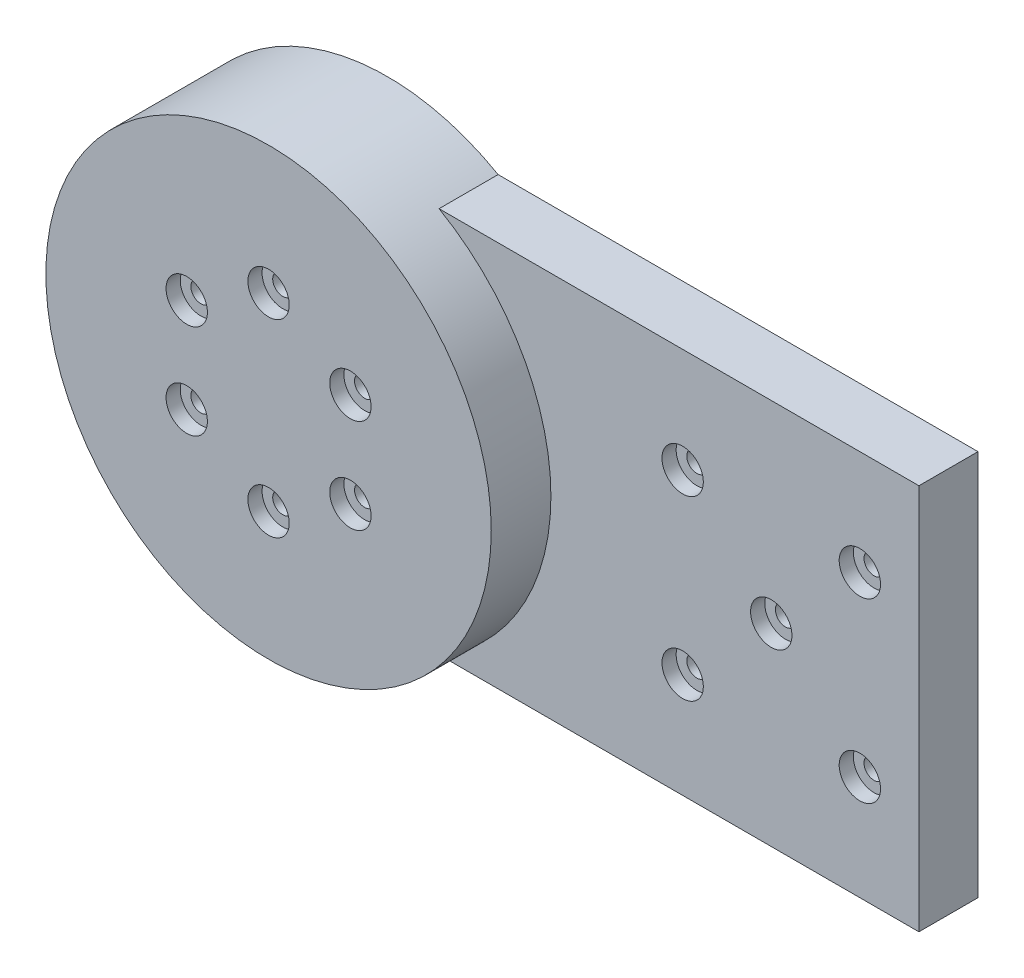
ISO-10303-21;
HEADER;
FILE_DESCRIPTION(('STEP AP214'),'2;1');
FILE_NAME('part.step','',(''),(''),'','','');
FILE_SCHEMA(('AUTOMOTIVE_DESIGN { 1 0 10303 214 1 1 1 1 }'));
ENDSEC;
DATA;
#1=APPLICATION_CONTEXT('core data for automotive mechanical design processes');
#2=APPLICATION_PROTOCOL_DEFINITION('international standard','automotive_design',2000,#1);
#3=PRODUCT_CONTEXT('',#1,'mechanical');
#4=PRODUCT('Part','Part','',(#3));
#5=PRODUCT_RELATED_PRODUCT_CATEGORY('part','',(#4));
#6=PRODUCT_DEFINITION_FORMATION('','',#4);
#7=PRODUCT_DEFINITION_CONTEXT('part definition',#1,'design');
#8=PRODUCT_DEFINITION('design','',#6,#7);
#9=PRODUCT_DEFINITION_SHAPE('','',#8);
#10=(LENGTH_UNIT() NAMED_UNIT(*) SI_UNIT(.MILLI.,.METRE.));
#11=(NAMED_UNIT(*) PLANE_ANGLE_UNIT() SI_UNIT($,.RADIAN.));
#12=(NAMED_UNIT(*) SI_UNIT($,.STERADIAN.) SOLID_ANGLE_UNIT());
#13=UNCERTAINTY_MEASURE_WITH_UNIT(LENGTH_MEASURE(1.E-05),#10,'distance_accuracy_value','');
#14=(GEOMETRIC_REPRESENTATION_CONTEXT(3) GLOBAL_UNCERTAINTY_ASSIGNED_CONTEXT((#13)) GLOBAL_UNIT_ASSIGNED_CONTEXT((#10,
#11,#12)) REPRESENTATION_CONTEXT('',''));
#15=CARTESIAN_POINT('',(0.,0.,0.));
#16=DIRECTION('',(0.,0.,1.));
#17=DIRECTION('',(1.,0.,0.));
#18=AXIS2_PLACEMENT_3D('',#15,#16,#17);
#19=CARTESIAN_POINT('',(0.,0.,0.));
#20=DIRECTION('',(0.,0.,1.));
#21=DIRECTION('',(1.,0.,0.));
#22=AXIS2_PLACEMENT_3D('',#19,#20,#21);
#23=PLANE('',#22);
#24=CARTESIAN_POINT('',(-13.8564064605507,7.99999999999941,0.));
#25=DIRECTION('',(0.,0.,1.));
#26=DIRECTION('',(1.,0.,0.));
#27=AXIS2_PLACEMENT_3D('',#24,#25,#26);
#28=CIRCLE('',#27,1.70000000000001);
#29=CARTESIAN_POINT('',(-12.1564064605507,7.99999999999941,0.));
#30=VERTEX_POINT('',#29);
#31=EDGE_CURVE('E41',#30,#30,#28,.T.);
#32=ORIENTED_EDGE('',*,*,#31,.T.);
#33=EDGE_LOOP('',(#32));
#34=FACE_BOUND('',#33,.T.);
#35=CARTESIAN_POINT('',(-13.85640646055,-8.0000000000006,0.));
#36=DIRECTION('',(0.,0.,1.));
#37=DIRECTION('',(1.,0.,0.));
#38=AXIS2_PLACEMENT_3D('',#35,#36,#37);
#39=CIRCLE('',#38,1.70000000000001);
#40=CARTESIAN_POINT('',(-12.15640646055,-8.0000000000006,0.));
#41=VERTEX_POINT('',#40);
#42=EDGE_CURVE('E174',#41,#41,#39,.T.);
#43=ORIENTED_EDGE('',*,*,#42,.T.);
#44=EDGE_LOOP('',(#43));
#45=FACE_BOUND('',#44,.T.);
#46=CARTESIAN_POINT('',(1.35836374802349E-12,-16.,0.));
#47=DIRECTION('',(0.,0.,1.));
#48=DIRECTION('',(1.,0.,0.));
#49=AXIS2_PLACEMENT_3D('',#46,#47,#48);
#50=CIRCLE('',#49,1.70000000000001);
#51=CARTESIAN_POINT('',(1.70000000000136,-16.,0.));
#52=VERTEX_POINT('',#51);
#53=EDGE_CURVE('E162',#52,#52,#50,.T.);
#54=ORIENTED_EDGE('',*,*,#53,.T.);
#55=EDGE_LOOP('',(#54));
#56=FACE_BOUND('',#55,.T.);
#57=CARTESIAN_POINT('',(13.856406460552,-7.99999999999941,0.));
#58=DIRECTION('',(0.,0.,1.));
#59=DIRECTION('',(1.,0.,0.));
#60=AXIS2_PLACEMENT_3D('',#57,#58,#59);
#61=CIRCLE('',#60,1.70000000000001);
#62=CARTESIAN_POINT('',(15.556406460552,-7.99999999999941,0.));
#63=VERTEX_POINT('',#62);
#64=EDGE_CURVE('E150',#63,#63,#61,.T.);
#65=ORIENTED_EDGE('',*,*,#64,.T.);
#66=EDGE_LOOP('',(#65));
#67=FACE_BOUND('',#66,.T.);
#68=CARTESIAN_POINT('',(13.8564064605514,8.00000000000059,0.));
#69=DIRECTION('',(0.,0.,1.));
#70=DIRECTION('',(1.,0.,0.));
#71=AXIS2_PLACEMENT_3D('',#68,#69,#70);
#72=CIRCLE('',#71,1.70000000000001);
#73=CARTESIAN_POINT('',(15.5564064605514,8.00000000000059,0.));
#74=VERTEX_POINT('',#73);
#75=EDGE_CURVE('E138',#74,#74,#72,.T.);
#76=ORIENTED_EDGE('',*,*,#75,.T.);
#77=EDGE_LOOP('',(#76));
#78=FACE_BOUND('',#77,.T.);
#79=CARTESIAN_POINT('',(0.,16.,0.));
#80=DIRECTION('',(0.,0.,1.));
#81=DIRECTION('',(1.,0.,0.));
#82=AXIS2_PLACEMENT_3D('',#79,#80,#81);
#83=CIRCLE('',#82,1.70000000000001);
#84=CARTESIAN_POINT('',(1.70000000000001,16.,0.));
#85=VERTEX_POINT('',#84);
#86=EDGE_CURVE('E126',#85,#85,#83,.T.);
#87=ORIENTED_EDGE('',*,*,#86,.T.);
#88=EDGE_LOOP('',(#87));
#89=FACE_BOUND('',#88,.T.);
#90=CARTESIAN_POINT('',(0.,0.,0.));
#91=DIRECTION('',(0.,0.,-1.));
#92=DIRECTION('',(-1.,0.,0.));
#93=AXIS2_PLACEMENT_3D('',#90,#91,#92);
#94=CIRCLE('',#93,32.8);
#95=CARTESIAN_POINT('',(-32.8,0.,0.));
#96=VERTEX_POINT('',#95);
#97=EDGE_CURVE('E107',#96,#96,#94,.T.);
#98=ORIENTED_EDGE('',*,*,#97,.T.);
#99=EDGE_LOOP('',(#98));
#100=FACE_BOUND('',#99,.T.);
#101=ADVANCED_FACE('F33',(#34,#45,#56,#67,#78,#89,#100),#23,.F.);
#102=CARTESIAN_POINT('',(0.,0.,7.));
#103=DIRECTION('',(0.,0.,-1.));
#104=DIRECTION('',(-1.,0.,0.));
#105=AXIS2_PLACEMENT_3D('',#102,#103,#104);
#106=CYLINDRICAL_SURFACE('',#105,37.7);
#107=CARTESIAN_POINT('',(0.,0.,-13.1));
#108=DIRECTION('',(0.,0.,-1.));
#109=DIRECTION('',(-1.,0.,0.));
#110=AXIS2_PLACEMENT_3D('',#107,#108,#109);
#111=CIRCLE('',#110,37.7);
#112=CARTESIAN_POINT('',(18.7616630392937,-32.7,-13.1));
#113=VERTEX_POINT('',#112);
#114=CARTESIAN_POINT('',(18.7616630392937,32.7,-13.1));
#115=VERTEX_POINT('',#114);
#116=EDGE_CURVE('E113',#113,#115,#111,.T.);
#117=ORIENTED_EDGE('',*,*,#116,.F.);
#118=DIRECTION('',(0.,0.,-1.));
#119=VECTOR('',#118,1.);
#120=CARTESIAN_POINT('',(18.7616630392937,-32.7,-3.1));
#121=LINE('',#120,#119);
#122=CARTESIAN_POINT('',(18.7616630392937,-32.7,-3.1));
#123=VERTEX_POINT('',#122);
#124=EDGE_CURVE('E105',#123,#113,#121,.T.);
#125=ORIENTED_EDGE('',*,*,#124,.F.);
#126=CARTESIAN_POINT('',(0.,0.,-3.1));
#127=DIRECTION('',(0.,0.,1.));
#128=DIRECTION('',(-1.,0.,0.));
#129=AXIS2_PLACEMENT_3D('',#126,#127,#128);
#130=CIRCLE('',#129,37.7);
#131=CARTESIAN_POINT('',(18.7616630392937,32.7,-3.1));
#132=VERTEX_POINT('',#131);
#133=EDGE_CURVE('E57',#123,#132,#130,.T.);
#134=ORIENTED_EDGE('',*,*,#133,.T.);
#135=DIRECTION('',(0.,0.,-1.));
#136=VECTOR('',#135,1.);
#137=CARTESIAN_POINT('',(18.7616630392937,32.7,-3.1));
#138=LINE('',#137,#136);
#139=EDGE_CURVE('E81',#132,#115,#138,.T.);
#140=ORIENTED_EDGE('',*,*,#139,.T.);
#141=EDGE_LOOP('',(#117,#125,#134,#140));
#142=FACE_BOUND('',#141,.T.);
#143=CARTESIAN_POINT('',(0.,0.,7.));
#144=DIRECTION('',(0.,0.,1.));
#145=DIRECTION('',(1.,0.,0.));
#146=AXIS2_PLACEMENT_3D('',#143,#144,#145);
#147=CIRCLE('',#146,37.7);
#148=CARTESIAN_POINT('',(37.7,0.,7.));
#149=VERTEX_POINT('',#148);
#150=EDGE_CURVE('E11',#149,#149,#147,.T.);
#151=ORIENTED_EDGE('',*,*,#150,.F.);
#152=EDGE_LOOP('',(#151));
#153=FACE_BOUND('',#152,.T.);
#154=ADVANCED_FACE('F35',(#142,#153),#106,.T.);
#155=CARTESIAN_POINT('',(0.,0.,7.));
#156=DIRECTION('',(0.,0.,1.));
#157=DIRECTION('',(1.,0.,0.));
#158=AXIS2_PLACEMENT_3D('',#155,#156,#157);
#159=PLANE('',#158);
#160=CARTESIAN_POINT('',(0.,16.,7.));
#161=DIRECTION('',(0.,0.,1.));
#162=DIRECTION('',(1.,0.,0.));
#163=AXIS2_PLACEMENT_3D('',#160,#161,#162);
#164=CIRCLE('',#163,3.5);
#165=CARTESIAN_POINT('',(3.5,16.,7.));
#166=VERTEX_POINT('',#165);
#167=EDGE_CURVE('E117',#166,#166,#164,.T.);
#168=ORIENTED_EDGE('',*,*,#167,.F.);
#169=EDGE_LOOP('',(#168));
#170=FACE_BOUND('',#169,.T.);
#171=CARTESIAN_POINT('',(13.8564064605514,8.00000000000059,7.));
#172=DIRECTION('',(0.,0.,1.));
#173=DIRECTION('',(1.,0.,0.));
#174=AXIS2_PLACEMENT_3D('',#171,#172,#173);
#175=CIRCLE('',#174,3.5);
#176=CARTESIAN_POINT('',(17.3564064605514,8.00000000000059,7.));
#177=VERTEX_POINT('',#176);
#178=EDGE_CURVE('E129',#177,#177,#175,.T.);
#179=ORIENTED_EDGE('',*,*,#178,.F.);
#180=EDGE_LOOP('',(#179));
#181=FACE_BOUND('',#180,.T.);
#182=CARTESIAN_POINT('',(13.856406460552,-7.99999999999941,7.));
#183=DIRECTION('',(0.,0.,1.));
#184=DIRECTION('',(1.,0.,0.));
#185=AXIS2_PLACEMENT_3D('',#182,#183,#184);
#186=CIRCLE('',#185,3.49999999999999);
#187=CARTESIAN_POINT('',(17.356406460552,-7.99999999999941,7.));
#188=VERTEX_POINT('',#187);
#189=EDGE_CURVE('E141',#188,#188,#186,.T.);
#190=ORIENTED_EDGE('',*,*,#189,.F.);
#191=EDGE_LOOP('',(#190));
#192=FACE_BOUND('',#191,.T.);
#193=CARTESIAN_POINT('',(1.35836374802349E-12,-16.,7.));
#194=DIRECTION('',(0.,0.,1.));
#195=DIRECTION('',(1.,0.,0.));
#196=AXIS2_PLACEMENT_3D('',#193,#194,#195);
#197=CIRCLE('',#196,3.5);
#198=CARTESIAN_POINT('',(3.50000000000135,-16.,7.));
#199=VERTEX_POINT('',#198);
#200=EDGE_CURVE('E153',#199,#199,#197,.T.);
#201=ORIENTED_EDGE('',*,*,#200,.F.);
#202=EDGE_LOOP('',(#201));
#203=FACE_BOUND('',#202,.T.);
#204=CARTESIAN_POINT('',(-13.85640646055,-8.0000000000006,7.));
#205=DIRECTION('',(0.,0.,1.));
#206=DIRECTION('',(1.,0.,0.));
#207=AXIS2_PLACEMENT_3D('',#204,#205,#206);
#208=CIRCLE('',#207,3.5);
#209=CARTESIAN_POINT('',(-10.35640646055,-8.0000000000006,7.));
#210=VERTEX_POINT('',#209);
#211=EDGE_CURVE('E165',#210,#210,#208,.T.);
#212=ORIENTED_EDGE('',*,*,#211,.F.);
#213=EDGE_LOOP('',(#212));
#214=FACE_BOUND('',#213,.T.);
#215=CARTESIAN_POINT('',(-13.8564064605507,7.99999999999941,7.));
#216=DIRECTION('',(0.,0.,1.));
#217=DIRECTION('',(1.,0.,0.));
#218=AXIS2_PLACEMENT_3D('',#215,#216,#217);
#219=CIRCLE('',#218,3.5);
#220=CARTESIAN_POINT('',(-10.3564064605507,7.99999999999941,7.));
#221=VERTEX_POINT('',#220);
#222=EDGE_CURVE('E177',#221,#221,#219,.T.);
#223=ORIENTED_EDGE('',*,*,#222,.F.);
#224=EDGE_LOOP('',(#223));
#225=FACE_BOUND('',#224,.T.);
#226=ORIENTED_EDGE('',*,*,#150,.T.);
#227=EDGE_LOOP('',(#226));
#228=FACE_BOUND('',#227,.T.);
#229=ADVANCED_FACE('F194',(#170,#181,#192,#203,#214,#225,#228),#159,.T.);
#230=CARTESIAN_POINT('',(-13.8564064605507,7.99999999999941,7.));
#231=DIRECTION('',(0.,0.,1.));
#232=DIRECTION('',(1.,0.,0.));
#233=AXIS2_PLACEMENT_3D('',#230,#231,#232);
#234=CYLINDRICAL_SURFACE('',#233,1.70000000000001);
#235=ORIENTED_EDGE('',*,*,#31,.F.);
#236=EDGE_LOOP('',(#235));
#237=FACE_BOUND('',#236,.T.);
#238=CARTESIAN_POINT('',(-13.8564064605507,7.99999999999941,4.6));
#239=DIRECTION('',(0.,0.,1.));
#240=DIRECTION('',(1.,0.,0.));
#241=AXIS2_PLACEMENT_3D('',#238,#239,#240);
#242=CIRCLE('',#241,1.70000000000001);
#243=CARTESIAN_POINT('',(-12.1564064605507,7.99999999999941,4.6));
#244=VERTEX_POINT('',#243);
#245=EDGE_CURVE('E183',#244,#244,#242,.T.);
#246=ORIENTED_EDGE('',*,*,#245,.T.);
#247=EDGE_LOOP('',(#246));
#248=FACE_BOUND('',#247,.T.);
#249=ADVANCED_FACE('F190',(#237,#248),#234,.F.);
#250=CARTESIAN_POINT('',(-12.1564064605507,7.99999999999941,4.6));
#251=DIRECTION('',(0.,0.,-1.));
#252=DIRECTION('',(-1.,0.,0.));
#253=AXIS2_PLACEMENT_3D('',#250,#251,#252);
#254=PLANE('',#253);
#255=ORIENTED_EDGE('',*,*,#245,.F.);
#256=EDGE_LOOP('',(#255));
#257=FACE_BOUND('',#256,.T.);
#258=CARTESIAN_POINT('',(-13.8564064605507,7.99999999999941,4.6));
#259=DIRECTION('',(0.,0.,1.));
#260=DIRECTION('',(1.,0.,0.));
#261=AXIS2_PLACEMENT_3D('',#258,#259,#260);
#262=CIRCLE('',#261,3.5);
#263=CARTESIAN_POINT('',(-10.3564064605507,7.99999999999941,4.6));
#264=VERTEX_POINT('',#263);
#265=EDGE_CURVE('E180',#264,#264,#262,.T.);
#266=ORIENTED_EDGE('',*,*,#265,.T.);
#267=EDGE_LOOP('',(#266));
#268=FACE_BOUND('',#267,.T.);
#269=ADVANCED_FACE('F193',(#257,#268),#254,.F.);
#270=CARTESIAN_POINT('',(-13.8564064605507,7.99999999999941,7.));
#271=DIRECTION('',(0.,0.,1.));
#272=DIRECTION('',(1.,0.,0.));
#273=AXIS2_PLACEMENT_3D('',#270,#271,#272);
#274=CYLINDRICAL_SURFACE('',#273,3.5);
#275=ORIENTED_EDGE('',*,*,#265,.F.);
#276=EDGE_LOOP('',(#275));
#277=FACE_BOUND('',#276,.T.);
#278=ORIENTED_EDGE('',*,*,#222,.T.);
#279=EDGE_LOOP('',(#278));
#280=FACE_BOUND('',#279,.T.);
#281=ADVANCED_FACE('F200',(#277,#280),#274,.F.);
#282=CARTESIAN_POINT('',(-13.85640646055,-8.0000000000006,7.));
#283=DIRECTION('',(0.,0.,1.));
#284=DIRECTION('',(1.,0.,0.));
#285=AXIS2_PLACEMENT_3D('',#282,#283,#284);
#286=CYLINDRICAL_SURFACE('',#285,1.70000000000001);
#287=ORIENTED_EDGE('',*,*,#42,.F.);
#288=EDGE_LOOP('',(#287));
#289=FACE_BOUND('',#288,.T.);
#290=CARTESIAN_POINT('',(-13.85640646055,-8.0000000000006,4.6));
#291=DIRECTION('',(0.,0.,1.));
#292=DIRECTION('',(1.,0.,0.));
#293=AXIS2_PLACEMENT_3D('',#290,#291,#292);
#294=CIRCLE('',#293,1.70000000000001);
#295=CARTESIAN_POINT('',(-12.15640646055,-8.0000000000006,4.6));
#296=VERTEX_POINT('',#295);
#297=EDGE_CURVE('E171',#296,#296,#294,.T.);
#298=ORIENTED_EDGE('',*,*,#297,.T.);
#299=EDGE_LOOP('',(#298));
#300=FACE_BOUND('',#299,.T.);
#301=ADVANCED_FACE('F206',(#289,#300),#286,.F.);
#302=CARTESIAN_POINT('',(-12.15640646055,-8.0000000000006,4.6));
#303=DIRECTION('',(0.,0.,-1.));
#304=DIRECTION('',(-1.,0.,0.));
#305=AXIS2_PLACEMENT_3D('',#302,#303,#304);
#306=PLANE('',#305);
#307=ORIENTED_EDGE('',*,*,#297,.F.);
#308=EDGE_LOOP('',(#307));
#309=FACE_BOUND('',#308,.T.);
#310=CARTESIAN_POINT('',(-13.85640646055,-8.0000000000006,4.6));
#311=DIRECTION('',(0.,0.,1.));
#312=DIRECTION('',(1.,0.,0.));
#313=AXIS2_PLACEMENT_3D('',#310,#311,#312);
#314=CIRCLE('',#313,3.5);
#315=CARTESIAN_POINT('',(-10.35640646055,-8.0000000000006,4.6));
#316=VERTEX_POINT('',#315);
#317=EDGE_CURVE('E168',#316,#316,#314,.T.);
#318=ORIENTED_EDGE('',*,*,#317,.T.);
#319=EDGE_LOOP('',(#318));
#320=FACE_BOUND('',#319,.T.);
#321=ADVANCED_FACE('F296',(#309,#320),#306,.F.);
#322=CARTESIAN_POINT('',(-13.85640646055,-8.0000000000006,7.));
#323=DIRECTION('',(0.,0.,1.));
#324=DIRECTION('',(1.,0.,0.));
#325=AXIS2_PLACEMENT_3D('',#322,#323,#324);
#326=CYLINDRICAL_SURFACE('',#325,3.5);
#327=ORIENTED_EDGE('',*,*,#317,.F.);
#328=EDGE_LOOP('',(#327));
#329=FACE_BOUND('',#328,.T.);
#330=ORIENTED_EDGE('',*,*,#211,.T.);
#331=EDGE_LOOP('',(#330));
#332=FACE_BOUND('',#331,.T.);
#333=ADVANCED_FACE('F292',(#329,#332),#326,.F.);
#334=CARTESIAN_POINT('',(1.35836374802349E-12,-16.,7.));
#335=DIRECTION('',(0.,0.,1.));
#336=DIRECTION('',(1.,0.,0.));
#337=AXIS2_PLACEMENT_3D('',#334,#335,#336);
#338=CYLINDRICAL_SURFACE('',#337,1.70000000000001);
#339=ORIENTED_EDGE('',*,*,#53,.F.);
#340=EDGE_LOOP('',(#339));
#341=FACE_BOUND('',#340,.T.);
#342=CARTESIAN_POINT('',(1.35836374802349E-12,-16.,4.6));
#343=DIRECTION('',(0.,0.,1.));
#344=DIRECTION('',(1.,0.,0.));
#345=AXIS2_PLACEMENT_3D('',#342,#343,#344);
#346=CIRCLE('',#345,1.70000000000001);
#347=CARTESIAN_POINT('',(1.70000000000137,-16.,4.6));
#348=VERTEX_POINT('',#347);
#349=EDGE_CURVE('E159',#348,#348,#346,.T.);
#350=ORIENTED_EDGE('',*,*,#349,.T.);
#351=EDGE_LOOP('',(#350));
#352=FACE_BOUND('',#351,.T.);
#353=ADVANCED_FACE('F288',(#341,#352),#338,.F.);
#354=CARTESIAN_POINT('',(1.70000000000137,-16.,4.6));
#355=DIRECTION('',(0.,0.,-1.));
#356=DIRECTION('',(-1.,0.,0.));
#357=AXIS2_PLACEMENT_3D('',#354,#355,#356);
#358=PLANE('',#357);
#359=ORIENTED_EDGE('',*,*,#349,.F.);
#360=EDGE_LOOP('',(#359));
#361=FACE_BOUND('',#360,.T.);
#362=CARTESIAN_POINT('',(1.35836374802349E-12,-16.,4.6));
#363=DIRECTION('',(0.,0.,1.));
#364=DIRECTION('',(1.,0.,0.));
#365=AXIS2_PLACEMENT_3D('',#362,#363,#364);
#366=CIRCLE('',#365,3.5);
#367=CARTESIAN_POINT('',(3.50000000000135,-16.,4.6));
#368=VERTEX_POINT('',#367);
#369=EDGE_CURVE('E156',#368,#368,#366,.T.);
#370=ORIENTED_EDGE('',*,*,#369,.T.);
#371=EDGE_LOOP('',(#370));
#372=FACE_BOUND('',#371,.T.);
#373=ADVANCED_FACE('F284',(#361,#372),#358,.F.);
#374=CARTESIAN_POINT('',(1.35836374802349E-12,-16.,7.));
#375=DIRECTION('',(0.,0.,1.));
#376=DIRECTION('',(1.,0.,0.));
#377=AXIS2_PLACEMENT_3D('',#374,#375,#376);
#378=CYLINDRICAL_SURFACE('',#377,3.5);
#379=ORIENTED_EDGE('',*,*,#369,.F.);
#380=EDGE_LOOP('',(#379));
#381=FACE_BOUND('',#380,.T.);
#382=ORIENTED_EDGE('',*,*,#200,.T.);
#383=EDGE_LOOP('',(#382));
#384=FACE_BOUND('',#383,.T.);
#385=ADVANCED_FACE('F280',(#381,#384),#378,.F.);
#386=CARTESIAN_POINT('',(13.856406460552,-7.99999999999941,7.));
#387=DIRECTION('',(0.,0.,1.));
#388=DIRECTION('',(1.,0.,0.));
#389=AXIS2_PLACEMENT_3D('',#386,#387,#388);
#390=CYLINDRICAL_SURFACE('',#389,1.70000000000001);
#391=ORIENTED_EDGE('',*,*,#64,.F.);
#392=EDGE_LOOP('',(#391));
#393=FACE_BOUND('',#392,.T.);
#394=CARTESIAN_POINT('',(13.856406460552,-7.99999999999941,4.6));
#395=DIRECTION('',(0.,0.,1.));
#396=DIRECTION('',(1.,0.,0.));
#397=AXIS2_PLACEMENT_3D('',#394,#395,#396);
#398=CIRCLE('',#397,1.70000000000001);
#399=CARTESIAN_POINT('',(15.556406460552,-7.99999999999941,4.6));
#400=VERTEX_POINT('',#399);
#401=EDGE_CURVE('E147',#400,#400,#398,.T.);
#402=ORIENTED_EDGE('',*,*,#401,.T.);
#403=EDGE_LOOP('',(#402));
#404=FACE_BOUND('',#403,.T.);
#405=ADVANCED_FACE('F276',(#393,#404),#390,.F.);
#406=CARTESIAN_POINT('',(15.556406460552,-7.99999999999941,4.6));
#407=DIRECTION('',(0.,0.,-1.));
#408=DIRECTION('',(-1.,0.,0.));
#409=AXIS2_PLACEMENT_3D('',#406,#407,#408);
#410=PLANE('',#409);
#411=ORIENTED_EDGE('',*,*,#401,.F.);
#412=EDGE_LOOP('',(#411));
#413=FACE_BOUND('',#412,.T.);
#414=CARTESIAN_POINT('',(13.856406460552,-7.99999999999941,4.6));
#415=DIRECTION('',(0.,0.,1.));
#416=DIRECTION('',(1.,0.,0.));
#417=AXIS2_PLACEMENT_3D('',#414,#415,#416);
#418=CIRCLE('',#417,3.49999999999999);
#419=CARTESIAN_POINT('',(17.356406460552,-7.99999999999941,4.6));
#420=VERTEX_POINT('',#419);
#421=EDGE_CURVE('E144',#420,#420,#418,.T.);
#422=ORIENTED_EDGE('',*,*,#421,.T.);
#423=EDGE_LOOP('',(#422));
#424=FACE_BOUND('',#423,.T.);
#425=ADVANCED_FACE('F272',(#413,#424),#410,.F.);
#426=CARTESIAN_POINT('',(13.856406460552,-7.99999999999941,7.));
#427=DIRECTION('',(0.,0.,1.));
#428=DIRECTION('',(1.,0.,0.));
#429=AXIS2_PLACEMENT_3D('',#426,#427,#428);
#430=CYLINDRICAL_SURFACE('',#429,3.49999999999999);
#431=ORIENTED_EDGE('',*,*,#421,.F.);
#432=EDGE_LOOP('',(#431));
#433=FACE_BOUND('',#432,.T.);
#434=ORIENTED_EDGE('',*,*,#189,.T.);
#435=EDGE_LOOP('',(#434));
#436=FACE_BOUND('',#435,.T.);
#437=ADVANCED_FACE('F268',(#433,#436),#430,.F.);
#438=CARTESIAN_POINT('',(13.8564064605514,8.00000000000059,7.));
#439=DIRECTION('',(0.,0.,1.));
#440=DIRECTION('',(1.,0.,0.));
#441=AXIS2_PLACEMENT_3D('',#438,#439,#440);
#442=CYLINDRICAL_SURFACE('',#441,1.70000000000001);
#443=ORIENTED_EDGE('',*,*,#75,.F.);
#444=EDGE_LOOP('',(#443));
#445=FACE_BOUND('',#444,.T.);
#446=CARTESIAN_POINT('',(13.8564064605514,8.00000000000059,4.6));
#447=DIRECTION('',(0.,0.,1.));
#448=DIRECTION('',(1.,0.,0.));
#449=AXIS2_PLACEMENT_3D('',#446,#447,#448);
#450=CIRCLE('',#449,1.70000000000001);
#451=CARTESIAN_POINT('',(15.5564064605514,8.00000000000059,4.6));
#452=VERTEX_POINT('',#451);
#453=EDGE_CURVE('E135',#452,#452,#450,.T.);
#454=ORIENTED_EDGE('',*,*,#453,.T.);
#455=EDGE_LOOP('',(#454));
#456=FACE_BOUND('',#455,.T.);
#457=ADVANCED_FACE('F264',(#445,#456),#442,.F.);
#458=CARTESIAN_POINT('',(15.5564064605514,8.00000000000059,4.6));
#459=DIRECTION('',(0.,0.,-1.));
#460=DIRECTION('',(-1.,0.,0.));
#461=AXIS2_PLACEMENT_3D('',#458,#459,#460);
#462=PLANE('',#461);
#463=ORIENTED_EDGE('',*,*,#453,.F.);
#464=EDGE_LOOP('',(#463));
#465=FACE_BOUND('',#464,.T.);
#466=CARTESIAN_POINT('',(13.8564064605514,8.00000000000059,4.6));
#467=DIRECTION('',(0.,0.,1.));
#468=DIRECTION('',(1.,0.,0.));
#469=AXIS2_PLACEMENT_3D('',#466,#467,#468);
#470=CIRCLE('',#469,3.5);
#471=CARTESIAN_POINT('',(17.3564064605514,8.00000000000059,4.6));
#472=VERTEX_POINT('',#471);
#473=EDGE_CURVE('E132',#472,#472,#470,.T.);
#474=ORIENTED_EDGE('',*,*,#473,.T.);
#475=EDGE_LOOP('',(#474));
#476=FACE_BOUND('',#475,.T.);
#477=ADVANCED_FACE('F260',(#465,#476),#462,.F.);
#478=CARTESIAN_POINT('',(13.8564064605514,8.00000000000059,7.));
#479=DIRECTION('',(0.,0.,1.));
#480=DIRECTION('',(1.,0.,0.));
#481=AXIS2_PLACEMENT_3D('',#478,#479,#480);
#482=CYLINDRICAL_SURFACE('',#481,3.5);
#483=ORIENTED_EDGE('',*,*,#473,.F.);
#484=EDGE_LOOP('',(#483));
#485=FACE_BOUND('',#484,.T.);
#486=ORIENTED_EDGE('',*,*,#178,.T.);
#487=EDGE_LOOP('',(#486));
#488=FACE_BOUND('',#487,.T.);
#489=ADVANCED_FACE('F256',(#485,#488),#482,.F.);
#490=CARTESIAN_POINT('',(0.,16.,7.));
#491=DIRECTION('',(0.,0.,1.));
#492=DIRECTION('',(1.,0.,0.));
#493=AXIS2_PLACEMENT_3D('',#490,#491,#492);
#494=CYLINDRICAL_SURFACE('',#493,1.70000000000001);
#495=ORIENTED_EDGE('',*,*,#86,.F.);
#496=EDGE_LOOP('',(#495));
#497=FACE_BOUND('',#496,.T.);
#498=CARTESIAN_POINT('',(0.,16.,4.6));
#499=DIRECTION('',(0.,0.,1.));
#500=DIRECTION('',(1.,0.,0.));
#501=AXIS2_PLACEMENT_3D('',#498,#499,#500);
#502=CIRCLE('',#501,1.70000000000001);
#503=CARTESIAN_POINT('',(1.70000000000001,16.,4.6));
#504=VERTEX_POINT('',#503);
#505=EDGE_CURVE('E123',#504,#504,#502,.T.);
#506=ORIENTED_EDGE('',*,*,#505,.T.);
#507=EDGE_LOOP('',(#506));
#508=FACE_BOUND('',#507,.T.);
#509=ADVANCED_FACE('F252',(#497,#508),#494,.F.);
#510=CARTESIAN_POINT('',(1.70000000000001,16.,4.6));
#511=DIRECTION('',(0.,0.,-1.));
#512=DIRECTION('',(-1.,0.,0.));
#513=AXIS2_PLACEMENT_3D('',#510,#511,#512);
#514=PLANE('',#513);
#515=ORIENTED_EDGE('',*,*,#505,.F.);
#516=EDGE_LOOP('',(#515));
#517=FACE_BOUND('',#516,.T.);
#518=CARTESIAN_POINT('',(0.,16.,4.6));
#519=DIRECTION('',(0.,0.,1.));
#520=DIRECTION('',(1.,0.,0.));
#521=AXIS2_PLACEMENT_3D('',#518,#519,#520);
#522=CIRCLE('',#521,3.5);
#523=CARTESIAN_POINT('',(3.5,16.,4.6));
#524=VERTEX_POINT('',#523);
#525=EDGE_CURVE('E120',#524,#524,#522,.T.);
#526=ORIENTED_EDGE('',*,*,#525,.T.);
#527=EDGE_LOOP('',(#526));
#528=FACE_BOUND('',#527,.T.);
#529=ADVANCED_FACE('F248',(#517,#528),#514,.F.);
#530=CARTESIAN_POINT('',(0.,16.,7.));
#531=DIRECTION('',(0.,0.,1.));
#532=DIRECTION('',(1.,0.,0.));
#533=AXIS2_PLACEMENT_3D('',#530,#531,#532);
#534=CYLINDRICAL_SURFACE('',#533,3.5);
#535=ORIENTED_EDGE('',*,*,#525,.F.);
#536=EDGE_LOOP('',(#535));
#537=FACE_BOUND('',#536,.T.);
#538=ORIENTED_EDGE('',*,*,#167,.T.);
#539=EDGE_LOOP('',(#538));
#540=FACE_BOUND('',#539,.T.);
#541=ADVANCED_FACE('F244',(#537,#540),#534,.F.);
#542=CARTESIAN_POINT('',(0.,0.,-13.1));
#543=DIRECTION('',(0.,0.,-1.));
#544=DIRECTION('',(-1.,0.,0.));
#545=AXIS2_PLACEMENT_3D('',#542,#543,#544);
#546=PLANE('',#545);
#547=CARTESIAN_POINT('',(75.,0.,-13.1));
#548=DIRECTION('',(0.,0.,-1.));
#549=DIRECTION('',(-1.,0.,0.));
#550=AXIS2_PLACEMENT_3D('',#547,#548,#549);
#551=CIRCLE('',#550,1.7);
#552=CARTESIAN_POINT('',(73.3,0.,-13.1));
#553=VERTEX_POINT('',#552);
#554=EDGE_CURVE('E616',#553,#553,#551,.T.);
#555=ORIENTED_EDGE('',*,*,#554,.F.);
#556=EDGE_LOOP('',(#555));
#557=FACE_BOUND('',#556,.T.);
#558=CARTESIAN_POINT('',(90.,15.,-13.1));
#559=DIRECTION('',(0.,0.,-1.));
#560=DIRECTION('',(-1.,0.,0.));
#561=AXIS2_PLACEMENT_3D('',#558,#559,#560);
#562=CIRCLE('',#561,1.7);
#563=CARTESIAN_POINT('',(88.3,15.,-13.1));
#564=VERTEX_POINT('',#563);
#565=EDGE_CURVE('E628',#564,#564,#562,.T.);
#566=ORIENTED_EDGE('',*,*,#565,.F.);
#567=EDGE_LOOP('',(#566));
#568=FACE_BOUND('',#567,.T.);
#569=CARTESIAN_POINT('',(60.,-15.,-13.1));
#570=DIRECTION('',(0.,0.,-1.));
#571=DIRECTION('',(-1.,0.,0.));
#572=AXIS2_PLACEMENT_3D('',#569,#570,#571);
#573=CIRCLE('',#572,1.70000000000001);
#574=CARTESIAN_POINT('',(58.3,-15.,-13.1));
#575=VERTEX_POINT('',#574);
#576=EDGE_CURVE('E640',#575,#575,#573,.T.);
#577=ORIENTED_EDGE('',*,*,#576,.F.);
#578=EDGE_LOOP('',(#577));
#579=FACE_BOUND('',#578,.T.);
#580=CARTESIAN_POINT('',(60.,15.,-13.1));
#581=DIRECTION('',(0.,0.,-1.));
#582=DIRECTION('',(-1.,0.,0.));
#583=AXIS2_PLACEMENT_3D('',#580,#581,#582);
#584=CIRCLE('',#583,1.70000000000001);
#585=CARTESIAN_POINT('',(58.3,15.,-13.1));
#586=VERTEX_POINT('',#585);
#587=EDGE_CURVE('E652',#586,#586,#584,.T.);
#588=ORIENTED_EDGE('',*,*,#587,.F.);
#589=EDGE_LOOP('',(#588));
#590=FACE_BOUND('',#589,.T.);
#591=CARTESIAN_POINT('',(90.,-15.,-13.1));
#592=DIRECTION('',(0.,0.,-1.));
#593=DIRECTION('',(-1.,0.,0.));
#594=AXIS2_PLACEMENT_3D('',#591,#592,#593);
#595=CIRCLE('',#594,1.7);
#596=CARTESIAN_POINT('',(88.3,-15.,-13.1));
#597=VERTEX_POINT('',#596);
#598=EDGE_CURVE('E102',#597,#597,#595,.T.);
#599=ORIENTED_EDGE('',*,*,#598,.F.);
#600=EDGE_LOOP('',(#599));
#601=FACE_BOUND('',#600,.T.);
#602=ORIENTED_EDGE('',*,*,#116,.T.);
#603=DIRECTION('',(1.,0.,0.));
#604=VECTOR('',#603,1.);
#605=CARTESIAN_POINT('',(18.7616630392937,32.7,-13.1));
#606=LINE('',#605,#604);
#607=CARTESIAN_POINT('',(100.,32.7,-13.1));
#608=VERTEX_POINT('',#607);
#609=EDGE_CURVE('E100',#115,#608,#606,.T.);
#610=ORIENTED_EDGE('',*,*,#609,.T.);
#611=DIRECTION('',(0.,-1.,0.));
#612=VECTOR('',#611,1.);
#613=CARTESIAN_POINT('',(100.,32.7,-13.1));
#614=LINE('',#613,#612);
#615=CARTESIAN_POINT('',(100.,-32.7,-13.1));
#616=VERTEX_POINT('',#615);
#617=EDGE_CURVE('E87',#608,#616,#614,.T.);
#618=ORIENTED_EDGE('',*,*,#617,.T.);
#619=DIRECTION('',(-1.,0.,0.));
#620=VECTOR('',#619,1.);
#621=CARTESIAN_POINT('',(100.,-32.7,-13.1));
#622=LINE('',#621,#620);
#623=EDGE_CURVE('E48',#616,#113,#622,.T.);
#624=ORIENTED_EDGE('',*,*,#623,.T.);
#625=EDGE_LOOP('',(#602,#610,#618,#624));
#626=FACE_BOUND('',#625,.T.);
#627=CARTESIAN_POINT('',(0.,0.,-13.1));
#628=DIRECTION('',(0.,0.,-1.));
#629=DIRECTION('',(-1.,0.,0.));
#630=AXIS2_PLACEMENT_3D('',#627,#628,#629);
#631=CIRCLE('',#630,32.8);
#632=CARTESIAN_POINT('',(-32.8,0.,-13.1));
#633=VERTEX_POINT('',#632);
#634=EDGE_CURVE('E110',#633,#633,#631,.T.);
#635=ORIENTED_EDGE('',*,*,#634,.F.);
#636=EDGE_LOOP('',(#635));
#637=FACE_BOUND('',#636,.T.);
#638=ADVANCED_FACE('F223',(#557,#568,#579,#590,#601,#626,#637),#546,.T.);
#639=CARTESIAN_POINT('',(0.,0.,-13.1));
#640=DIRECTION('',(0.,0.,1.));
#641=DIRECTION('',(1.,0.,0.));
#642=AXIS2_PLACEMENT_3D('',#639,#640,#641);
#643=CYLINDRICAL_SURFACE('',#642,32.8);
#644=ORIENTED_EDGE('',*,*,#634,.T.);
#645=EDGE_LOOP('',(#644));
#646=FACE_BOUND('',#645,.T.);
#647=ORIENTED_EDGE('',*,*,#97,.F.);
#648=EDGE_LOOP('',(#647));
#649=FACE_BOUND('',#648,.T.);
#650=ADVANCED_FACE('F228',(#646,#649),#643,.F.);
#651=CARTESIAN_POINT('',(100.,-32.7,-3.1));
#652=DIRECTION('',(0.,-1.,0.));
#653=DIRECTION('',(0.,0.,-1.));
#654=AXIS2_PLACEMENT_3D('',#651,#652,#653);
#655=PLANE('',#654);
#656=ORIENTED_EDGE('',*,*,#623,.F.);
#657=DIRECTION('',(0.,0.,-1.));
#658=VECTOR('',#657,1.);
#659=CARTESIAN_POINT('',(100.,-32.7,-3.1));
#660=LINE('',#659,#658);
#661=CARTESIAN_POINT('',(100.,-32.7,-3.1));
#662=VERTEX_POINT('',#661);
#663=EDGE_CURVE('E75',#662,#616,#660,.T.);
#664=ORIENTED_EDGE('',*,*,#663,.F.);
#665=DIRECTION('',(-1.,0.,0.));
#666=VECTOR('',#665,1.);
#667=CARTESIAN_POINT('',(100.,-32.7,-3.1));
#668=LINE('',#667,#666);
#669=EDGE_CURVE('E92',#662,#123,#668,.T.);
#670=ORIENTED_EDGE('',*,*,#669,.T.);
#671=ORIENTED_EDGE('',*,*,#124,.T.);
#672=EDGE_LOOP('',(#656,#664,#670,#671));
#673=FACE_BOUND('',#672,.T.);
#674=ADVANCED_FACE('F226',(#673),#655,.T.);
#675=CARTESIAN_POINT('',(100.,32.7,-3.1));
#676=DIRECTION('',(1.,0.,0.));
#677=DIRECTION('',(0.,0.,-1.));
#678=AXIS2_PLACEMENT_3D('',#675,#676,#677);
#679=PLANE('',#678);
#680=ORIENTED_EDGE('',*,*,#617,.F.);
#681=DIRECTION('',(0.,0.,-1.));
#682=VECTOR('',#681,1.);
#683=CARTESIAN_POINT('',(100.,32.7,-3.1));
#684=LINE('',#683,#682);
#685=CARTESIAN_POINT('',(100.,32.7,-3.1));
#686=VERTEX_POINT('',#685);
#687=EDGE_CURVE('E83',#686,#608,#684,.T.);
#688=ORIENTED_EDGE('',*,*,#687,.F.);
#689=DIRECTION('',(0.,-1.,0.));
#690=VECTOR('',#689,1.);
#691=CARTESIAN_POINT('',(100.,32.7,-3.1));
#692=LINE('',#691,#690);
#693=EDGE_CURVE('E86',#686,#662,#692,.T.);
#694=ORIENTED_EDGE('',*,*,#693,.T.);
#695=ORIENTED_EDGE('',*,*,#663,.T.);
#696=EDGE_LOOP('',(#680,#688,#694,#695));
#697=FACE_BOUND('',#696,.T.);
#698=ADVANCED_FACE('F85',(#697),#679,.T.);
#699=CARTESIAN_POINT('',(18.7616630392937,32.7,-3.1));
#700=DIRECTION('',(0.,1.,0.));
#701=DIRECTION('',(0.,0.,1.));
#702=AXIS2_PLACEMENT_3D('',#699,#700,#701);
#703=PLANE('',#702);
#704=ORIENTED_EDGE('',*,*,#609,.F.);
#705=ORIENTED_EDGE('',*,*,#139,.F.);
#706=DIRECTION('',(1.,0.,0.));
#707=VECTOR('',#706,1.);
#708=CARTESIAN_POINT('',(18.7616630392937,32.7,-3.1));
#709=LINE('',#708,#707);
#710=EDGE_CURVE('E91',#132,#686,#709,.T.);
#711=ORIENTED_EDGE('',*,*,#710,.T.);
#712=ORIENTED_EDGE('',*,*,#687,.T.);
#713=EDGE_LOOP('',(#704,#705,#711,#712));
#714=FACE_BOUND('',#713,.T.);
#715=ADVANCED_FACE('F94',(#714),#703,.T.);
#716=CARTESIAN_POINT('',(0.,0.,-3.1));
#717=DIRECTION('',(0.,0.,-1.));
#718=DIRECTION('',(-1.,0.,0.));
#719=AXIS2_PLACEMENT_3D('',#716,#717,#718);
#720=PLANE('',#719);
#721=CARTESIAN_POINT('',(75.,0.,-3.1));
#722=DIRECTION('',(0.,0.,1.));
#723=DIRECTION('',(1.,0.,0.));
#724=AXIS2_PLACEMENT_3D('',#721,#722,#723);
#725=CIRCLE('',#724,3.5);
#726=CARTESIAN_POINT('',(78.5,0.,-3.1));
#727=VERTEX_POINT('',#726);
#728=EDGE_CURVE('E609',#727,#727,#725,.T.);
#729=ORIENTED_EDGE('',*,*,#728,.F.);
#730=EDGE_LOOP('',(#729));
#731=FACE_BOUND('',#730,.T.);
#732=CARTESIAN_POINT('',(90.,15.,-3.1));
#733=DIRECTION('',(0.,0.,1.));
#734=DIRECTION('',(1.,0.,0.));
#735=AXIS2_PLACEMENT_3D('',#732,#733,#734);
#736=CIRCLE('',#735,3.5);
#737=CARTESIAN_POINT('',(93.5,15.,-3.1));
#738=VERTEX_POINT('',#737);
#739=EDGE_CURVE('E619',#738,#738,#736,.T.);
#740=ORIENTED_EDGE('',*,*,#739,.F.);
#741=EDGE_LOOP('',(#740));
#742=FACE_BOUND('',#741,.T.);
#743=CARTESIAN_POINT('',(60.,-15.,-3.1));
#744=DIRECTION('',(0.,0.,1.));
#745=DIRECTION('',(1.,0.,0.));
#746=AXIS2_PLACEMENT_3D('',#743,#744,#745);
#747=CIRCLE('',#746,3.5);
#748=CARTESIAN_POINT('',(63.5,-15.,-3.1));
#749=VERTEX_POINT('',#748);
#750=EDGE_CURVE('E631',#749,#749,#747,.T.);
#751=ORIENTED_EDGE('',*,*,#750,.F.);
#752=EDGE_LOOP('',(#751));
#753=FACE_BOUND('',#752,.T.);
#754=CARTESIAN_POINT('',(60.,15.,-3.1));
#755=DIRECTION('',(0.,0.,1.));
#756=DIRECTION('',(1.,0.,0.));
#757=AXIS2_PLACEMENT_3D('',#754,#755,#756);
#758=CIRCLE('',#757,3.5);
#759=CARTESIAN_POINT('',(63.5,15.,-3.1));
#760=VERTEX_POINT('',#759);
#761=EDGE_CURVE('E643',#760,#760,#758,.T.);
#762=ORIENTED_EDGE('',*,*,#761,.F.);
#763=EDGE_LOOP('',(#762));
#764=FACE_BOUND('',#763,.T.);
#765=CARTESIAN_POINT('',(90.,-15.,-3.1));
#766=DIRECTION('',(0.,0.,1.));
#767=DIRECTION('',(1.,0.,0.));
#768=AXIS2_PLACEMENT_3D('',#765,#766,#767);
#769=CIRCLE('',#768,3.5);
#770=CARTESIAN_POINT('',(93.5,-15.,-3.1));
#771=VERTEX_POINT('',#770);
#772=EDGE_CURVE('E655',#771,#771,#769,.T.);
#773=ORIENTED_EDGE('',*,*,#772,.F.);
#774=EDGE_LOOP('',(#773));
#775=FACE_BOUND('',#774,.T.);
#776=ORIENTED_EDGE('',*,*,#133,.F.);
#777=ORIENTED_EDGE('',*,*,#669,.F.);
#778=ORIENTED_EDGE('',*,*,#693,.F.);
#779=ORIENTED_EDGE('',*,*,#710,.F.);
#780=EDGE_LOOP('',(#776,#777,#778,#779));
#781=FACE_BOUND('',#780,.T.);
#782=ADVANCED_FACE('F90',(#731,#742,#753,#764,#775,#781),#720,.F.);
#783=CARTESIAN_POINT('',(90.,-15.,-3.1));
#784=DIRECTION('',(0.,0.,1.));
#785=DIRECTION('',(1.,0.,0.));
#786=AXIS2_PLACEMENT_3D('',#783,#784,#785);
#787=CYLINDRICAL_SURFACE('',#786,1.7);
#788=CARTESIAN_POINT('',(90.,-15.,-5.5));
#789=DIRECTION('',(0.,0.,1.));
#790=DIRECTION('',(1.,0.,0.));
#791=AXIS2_PLACEMENT_3D('',#788,#789,#790);
#792=CIRCLE('',#791,1.70000000000001);
#793=CARTESIAN_POINT('',(91.7,-15.,-5.5));
#794=VERTEX_POINT('',#793);
#795=EDGE_CURVE('E661',#794,#794,#792,.T.);
#796=ORIENTED_EDGE('',*,*,#795,.T.);
#797=EDGE_LOOP('',(#796));
#798=FACE_BOUND('',#797,.T.);
#799=ORIENTED_EDGE('',*,*,#598,.T.);
#800=EDGE_LOOP('',(#799));
#801=FACE_BOUND('',#800,.T.);
#802=ADVANCED_FACE('F451',(#798,#801),#787,.F.);
#803=CARTESIAN_POINT('',(91.7,-15.,-5.5));
#804=DIRECTION('',(0.,0.,-1.));
#805=DIRECTION('',(-1.,0.,0.));
#806=AXIS2_PLACEMENT_3D('',#803,#804,#805);
#807=PLANE('',#806);
#808=ORIENTED_EDGE('',*,*,#795,.F.);
#809=EDGE_LOOP('',(#808));
#810=FACE_BOUND('',#809,.T.);
#811=CARTESIAN_POINT('',(90.,-15.,-5.5));
#812=DIRECTION('',(0.,0.,1.));
#813=DIRECTION('',(1.,0.,0.));
#814=AXIS2_PLACEMENT_3D('',#811,#812,#813);
#815=CIRCLE('',#814,3.5);
#816=CARTESIAN_POINT('',(93.5,-15.,-5.5));
#817=VERTEX_POINT('',#816);
#818=EDGE_CURVE('E658',#817,#817,#815,.T.);
#819=ORIENTED_EDGE('',*,*,#818,.T.);
#820=EDGE_LOOP('',(#819));
#821=FACE_BOUND('',#820,.T.);
#822=ADVANCED_FACE('F457',(#810,#821),#807,.F.);
#823=CARTESIAN_POINT('',(90.,-15.,-3.1));
#824=DIRECTION('',(0.,0.,1.));
#825=DIRECTION('',(1.,0.,0.));
#826=AXIS2_PLACEMENT_3D('',#823,#824,#825);
#827=CYLINDRICAL_SURFACE('',#826,3.5);
#828=ORIENTED_EDGE('',*,*,#818,.F.);
#829=EDGE_LOOP('',(#828));
#830=FACE_BOUND('',#829,.T.);
#831=ORIENTED_EDGE('',*,*,#772,.T.);
#832=EDGE_LOOP('',(#831));
#833=FACE_BOUND('',#832,.T.);
#834=ADVANCED_FACE('F464',(#830,#833),#827,.F.);
#835=CARTESIAN_POINT('',(60.,15.,-3.1));
#836=DIRECTION('',(0.,0.,1.));
#837=DIRECTION('',(1.,0.,0.));
#838=AXIS2_PLACEMENT_3D('',#835,#836,#837);
#839=CYLINDRICAL_SURFACE('',#838,1.70000000000001);
#840=CARTESIAN_POINT('',(60.,15.,-5.5));
#841=DIRECTION('',(0.,0.,1.));
#842=DIRECTION('',(1.,0.,0.));
#843=AXIS2_PLACEMENT_3D('',#840,#841,#842);
#844=CIRCLE('',#843,1.70000000000001);
#845=CARTESIAN_POINT('',(61.7,15.,-5.5));
#846=VERTEX_POINT('',#845);
#847=EDGE_CURVE('E649',#846,#846,#844,.T.);
#848=ORIENTED_EDGE('',*,*,#847,.T.);
#849=EDGE_LOOP('',(#848));
#850=FACE_BOUND('',#849,.T.);
#851=ORIENTED_EDGE('',*,*,#587,.T.);
#852=EDGE_LOOP('',(#851));
#853=FACE_BOUND('',#852,.T.);
#854=ADVANCED_FACE('F472',(#850,#853),#839,.F.);
#855=CARTESIAN_POINT('',(61.7,15.,-5.5));
#856=DIRECTION('',(0.,0.,-1.));
#857=DIRECTION('',(-1.,0.,0.));
#858=AXIS2_PLACEMENT_3D('',#855,#856,#857);
#859=PLANE('',#858);
#860=ORIENTED_EDGE('',*,*,#847,.F.);
#861=EDGE_LOOP('',(#860));
#862=FACE_BOUND('',#861,.T.);
#863=CARTESIAN_POINT('',(60.,15.,-5.5));
#864=DIRECTION('',(0.,0.,1.));
#865=DIRECTION('',(1.,0.,0.));
#866=AXIS2_PLACEMENT_3D('',#863,#864,#865);
#867=CIRCLE('',#866,3.5);
#868=CARTESIAN_POINT('',(63.5,15.,-5.5));
#869=VERTEX_POINT('',#868);
#870=EDGE_CURVE('E646',#869,#869,#867,.T.);
#871=ORIENTED_EDGE('',*,*,#870,.T.);
#872=EDGE_LOOP('',(#871));
#873=FACE_BOUND('',#872,.T.);
#874=ADVANCED_FACE('F480',(#862,#873),#859,.F.);
#875=CARTESIAN_POINT('',(60.,15.,-3.1));
#876=DIRECTION('',(0.,0.,1.));
#877=DIRECTION('',(1.,0.,0.));
#878=AXIS2_PLACEMENT_3D('',#875,#876,#877);
#879=CYLINDRICAL_SURFACE('',#878,3.5);
#880=ORIENTED_EDGE('',*,*,#870,.F.);
#881=EDGE_LOOP('',(#880));
#882=FACE_BOUND('',#881,.T.);
#883=ORIENTED_EDGE('',*,*,#761,.T.);
#884=EDGE_LOOP('',(#883));
#885=FACE_BOUND('',#884,.T.);
#886=ADVANCED_FACE('F488',(#882,#885),#879,.F.);
#887=CARTESIAN_POINT('',(60.,-15.,-3.1));
#888=DIRECTION('',(0.,0.,1.));
#889=DIRECTION('',(1.,0.,0.));
#890=AXIS2_PLACEMENT_3D('',#887,#888,#889);
#891=CYLINDRICAL_SURFACE('',#890,1.70000000000001);
#892=CARTESIAN_POINT('',(60.,-15.,-5.5));
#893=DIRECTION('',(0.,0.,1.));
#894=DIRECTION('',(1.,0.,0.));
#895=AXIS2_PLACEMENT_3D('',#892,#893,#894);
#896=CIRCLE('',#895,1.70000000000001);
#897=CARTESIAN_POINT('',(61.7,-15.,-5.5));
#898=VERTEX_POINT('',#897);
#899=EDGE_CURVE('E637',#898,#898,#896,.T.);
#900=ORIENTED_EDGE('',*,*,#899,.T.);
#901=EDGE_LOOP('',(#900));
#902=FACE_BOUND('',#901,.T.);
#903=ORIENTED_EDGE('',*,*,#576,.T.);
#904=EDGE_LOOP('',(#903));
#905=FACE_BOUND('',#904,.T.);
#906=ADVANCED_FACE('F496',(#902,#905),#891,.F.);
#907=CARTESIAN_POINT('',(61.7,-15.,-5.5));
#908=DIRECTION('',(0.,0.,-1.));
#909=DIRECTION('',(-1.,0.,0.));
#910=AXIS2_PLACEMENT_3D('',#907,#908,#909);
#911=PLANE('',#910);
#912=ORIENTED_EDGE('',*,*,#899,.F.);
#913=EDGE_LOOP('',(#912));
#914=FACE_BOUND('',#913,.T.);
#915=CARTESIAN_POINT('',(60.,-15.,-5.5));
#916=DIRECTION('',(0.,0.,1.));
#917=DIRECTION('',(1.,0.,0.));
#918=AXIS2_PLACEMENT_3D('',#915,#916,#917);
#919=CIRCLE('',#918,3.5);
#920=CARTESIAN_POINT('',(63.5,-15.,-5.5));
#921=VERTEX_POINT('',#920);
#922=EDGE_CURVE('E634',#921,#921,#919,.T.);
#923=ORIENTED_EDGE('',*,*,#922,.T.);
#924=EDGE_LOOP('',(#923));
#925=FACE_BOUND('',#924,.T.);
#926=ADVANCED_FACE('F504',(#914,#925),#911,.F.);
#927=CARTESIAN_POINT('',(60.,-15.,-3.1));
#928=DIRECTION('',(0.,0.,1.));
#929=DIRECTION('',(1.,0.,0.));
#930=AXIS2_PLACEMENT_3D('',#927,#928,#929);
#931=CYLINDRICAL_SURFACE('',#930,3.5);
#932=ORIENTED_EDGE('',*,*,#922,.F.);
#933=EDGE_LOOP('',(#932));
#934=FACE_BOUND('',#933,.T.);
#935=ORIENTED_EDGE('',*,*,#750,.T.);
#936=EDGE_LOOP('',(#935));
#937=FACE_BOUND('',#936,.T.);
#938=ADVANCED_FACE('F512',(#934,#937),#931,.F.);
#939=CARTESIAN_POINT('',(90.,15.,-3.1));
#940=DIRECTION('',(0.,0.,1.));
#941=DIRECTION('',(1.,0.,0.));
#942=AXIS2_PLACEMENT_3D('',#939,#940,#941);
#943=CYLINDRICAL_SURFACE('',#942,1.7);
#944=CARTESIAN_POINT('',(90.,15.,-5.5));
#945=DIRECTION('',(0.,0.,1.));
#946=DIRECTION('',(1.,0.,0.));
#947=AXIS2_PLACEMENT_3D('',#944,#945,#946);
#948=CIRCLE('',#947,1.70000000000001);
#949=CARTESIAN_POINT('',(91.7,15.,-5.5));
#950=VERTEX_POINT('',#949);
#951=EDGE_CURVE('E625',#950,#950,#948,.T.);
#952=ORIENTED_EDGE('',*,*,#951,.T.);
#953=EDGE_LOOP('',(#952));
#954=FACE_BOUND('',#953,.T.);
#955=ORIENTED_EDGE('',*,*,#565,.T.);
#956=EDGE_LOOP('',(#955));
#957=FACE_BOUND('',#956,.T.);
#958=ADVANCED_FACE('F520',(#954,#957),#943,.F.);
#959=CARTESIAN_POINT('',(91.7,15.,-5.5));
#960=DIRECTION('',(0.,0.,-1.));
#961=DIRECTION('',(-1.,0.,0.));
#962=AXIS2_PLACEMENT_3D('',#959,#960,#961);
#963=PLANE('',#962);
#964=ORIENTED_EDGE('',*,*,#951,.F.);
#965=EDGE_LOOP('',(#964));
#966=FACE_BOUND('',#965,.T.);
#967=CARTESIAN_POINT('',(90.,15.,-5.5));
#968=DIRECTION('',(0.,0.,1.));
#969=DIRECTION('',(1.,0.,0.));
#970=AXIS2_PLACEMENT_3D('',#967,#968,#969);
#971=CIRCLE('',#970,3.5);
#972=CARTESIAN_POINT('',(93.5,15.,-5.5));
#973=VERTEX_POINT('',#972);
#974=EDGE_CURVE('E622',#973,#973,#971,.T.);
#975=ORIENTED_EDGE('',*,*,#974,.T.);
#976=EDGE_LOOP('',(#975));
#977=FACE_BOUND('',#976,.T.);
#978=ADVANCED_FACE('F528',(#966,#977),#963,.F.);
#979=CARTESIAN_POINT('',(90.,15.,-3.1));
#980=DIRECTION('',(0.,0.,1.));
#981=DIRECTION('',(1.,0.,0.));
#982=AXIS2_PLACEMENT_3D('',#979,#980,#981);
#983=CYLINDRICAL_SURFACE('',#982,3.5);
#984=ORIENTED_EDGE('',*,*,#974,.F.);
#985=EDGE_LOOP('',(#984));
#986=FACE_BOUND('',#985,.T.);
#987=ORIENTED_EDGE('',*,*,#739,.T.);
#988=EDGE_LOOP('',(#987));
#989=FACE_BOUND('',#988,.T.);
#990=ADVANCED_FACE('F536',(#986,#989),#983,.F.);
#991=CARTESIAN_POINT('',(75.,0.,-3.1));
#992=DIRECTION('',(0.,0.,1.));
#993=DIRECTION('',(1.,0.,0.));
#994=AXIS2_PLACEMENT_3D('',#991,#992,#993);
#995=CYLINDRICAL_SURFACE('',#994,1.7);
#996=CARTESIAN_POINT('',(75.,0.,-5.5));
#997=DIRECTION('',(0.,0.,1.));
#998=DIRECTION('',(1.,0.,0.));
#999=AXIS2_PLACEMENT_3D('',#996,#997,#998);
#1000=CIRCLE('',#999,1.70000000000001);
#1001=CARTESIAN_POINT('',(76.7,0.,-5.5));
#1002=VERTEX_POINT('',#1001);
#1003=EDGE_CURVE('E611',#1002,#1002,#1000,.T.);
#1004=ORIENTED_EDGE('',*,*,#1003,.T.);
#1005=EDGE_LOOP('',(#1004));
#1006=FACE_BOUND('',#1005,.T.);
#1007=ORIENTED_EDGE('',*,*,#554,.T.);
#1008=EDGE_LOOP('',(#1007));
#1009=FACE_BOUND('',#1008,.T.);
#1010=ADVANCED_FACE('F544',(#1006,#1009),#995,.F.);
#1011=CARTESIAN_POINT('',(76.7,0.,-5.5));
#1012=DIRECTION('',(0.,0.,-1.));
#1013=DIRECTION('',(-1.,0.,0.));
#1014=AXIS2_PLACEMENT_3D('',#1011,#1012,#1013);
#1015=PLANE('',#1014);
#1016=ORIENTED_EDGE('',*,*,#1003,.F.);
#1017=EDGE_LOOP('',(#1016));
#1018=FACE_BOUND('',#1017,.T.);
#1019=CARTESIAN_POINT('',(75.,0.,-5.5));
#1020=DIRECTION('',(0.,0.,1.));
#1021=DIRECTION('',(1.,0.,0.));
#1022=AXIS2_PLACEMENT_3D('',#1019,#1020,#1021);
#1023=CIRCLE('',#1022,3.5);
#1024=CARTESIAN_POINT('',(78.5,0.,-5.5));
#1025=VERTEX_POINT('',#1024);
#1026=EDGE_CURVE('E606',#1025,#1025,#1023,.T.);
#1027=ORIENTED_EDGE('',*,*,#1026,.T.);
#1028=EDGE_LOOP('',(#1027));
#1029=FACE_BOUND('',#1028,.T.);
#1030=ADVANCED_FACE('F552',(#1018,#1029),#1015,.F.);
#1031=CARTESIAN_POINT('',(75.,0.,-3.1));
#1032=DIRECTION('',(0.,0.,1.));
#1033=DIRECTION('',(1.,0.,0.));
#1034=AXIS2_PLACEMENT_3D('',#1031,#1032,#1033);
#1035=CYLINDRICAL_SURFACE('',#1034,3.5);
#1036=ORIENTED_EDGE('',*,*,#1026,.F.);
#1037=EDGE_LOOP('',(#1036));
#1038=FACE_BOUND('',#1037,.T.);
#1039=ORIENTED_EDGE('',*,*,#728,.T.);
#1040=EDGE_LOOP('',(#1039));
#1041=FACE_BOUND('',#1040,.T.);
#1042=ADVANCED_FACE('F560',(#1038,#1041),#1035,.F.);
#1043=CLOSED_SHELL('',(#101,#154,#229,#249,#269,#281,#301,#321,#333,#353,#373,#385,#405,#425,
#437,#457,#477,#489,#509,#529,#541,#638,#650,#674,#698,#715,#782,#802,#822,#834,#854,#874,#886,
#906,#926,#938,#958,#978,#990,#1010,#1030,#1042));
#1044=MANIFOLD_SOLID_BREP('B2',#1043);
#1045=ADVANCED_BREP_SHAPE_REPRESENTATION('',(#18,#1044),#14);
#1046=SHAPE_DEFINITION_REPRESENTATION(#9,#1045);
ENDSEC;
END-ISO-10303-21;
